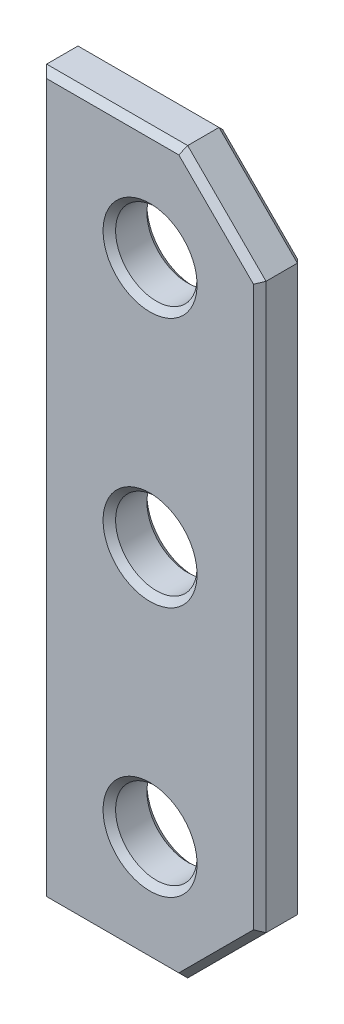
ISO-10303-21;
HEADER;
FILE_DESCRIPTION(('STEP AP214'),'2;1');
FILE_NAME('part.step','',(''),(''),'','','');
FILE_SCHEMA(('AUTOMOTIVE_DESIGN { 1 0 10303 214 1 1 1 1 }'));
ENDSEC;
DATA;
#1=APPLICATION_CONTEXT('core data for automotive mechanical design processes');
#2=APPLICATION_PROTOCOL_DEFINITION('international standard','automotive_design',2000,#1);
#3=PRODUCT_CONTEXT('',#1,'mechanical');
#4=PRODUCT('Part','Part','',(#3));
#5=PRODUCT_RELATED_PRODUCT_CATEGORY('part','',(#4));
#6=PRODUCT_DEFINITION_FORMATION('','',#4);
#7=PRODUCT_DEFINITION_CONTEXT('part definition',#1,'design');
#8=PRODUCT_DEFINITION('design','',#6,#7);
#9=PRODUCT_DEFINITION_SHAPE('','',#8);
#10=(LENGTH_UNIT() NAMED_UNIT(*) SI_UNIT(.MILLI.,.METRE.));
#11=(NAMED_UNIT(*) PLANE_ANGLE_UNIT() SI_UNIT($,.RADIAN.));
#12=(NAMED_UNIT(*) SI_UNIT($,.STERADIAN.) SOLID_ANGLE_UNIT());
#13=UNCERTAINTY_MEASURE_WITH_UNIT(LENGTH_MEASURE(1.E-05),#10,'distance_accuracy_value','');
#14=(GEOMETRIC_REPRESENTATION_CONTEXT(3) GLOBAL_UNCERTAINTY_ASSIGNED_CONTEXT((#13)) GLOBAL_UNIT_ASSIGNED_CONTEXT((#10,
#11,#12)) REPRESENTATION_CONTEXT('',''));
#15=CARTESIAN_POINT('',(0.,0.,0.));
#16=DIRECTION('',(0.,0.,1.));
#17=DIRECTION('',(1.,0.,0.));
#18=AXIS2_PLACEMENT_3D('',#15,#16,#17);
#19=CARTESIAN_POINT('',(0.,230.,14.));
#20=DIRECTION('',(0.,0.,-1.));
#21=DIRECTION('',(-1.,0.,0.));
#22=AXIS2_PLACEMENT_3D('',#19,#20,#21);
#23=PLANE('',#22);
#24=CARTESIAN_POINT('',(35.,195.,14.));
#25=DIRECTION('',(0.,0.,-1.));
#26=DIRECTION('',(-1.,0.,0.));
#27=AXIS2_PLACEMENT_3D('',#24,#25,#26);
#28=CIRCLE('',#27,15.);
#29=CARTESIAN_POINT('',(20.,195.,14.));
#30=VERTEX_POINT('',#29);
#31=EDGE_CURVE('E11',#30,#30,#28,.T.);
#32=ORIENTED_EDGE('',*,*,#31,.T.);
#33=EDGE_LOOP('',(#32));
#34=FACE_BOUND('',#33,.T.);
#35=CARTESIAN_POINT('',(35.,35.,14.));
#36=DIRECTION('',(0.,0.,-1.));
#37=DIRECTION('',(-1.,0.,0.));
#38=AXIS2_PLACEMENT_3D('',#35,#36,#37);
#39=CIRCLE('',#38,15.);
#40=CARTESIAN_POINT('',(20.,35.,14.));
#41=VERTEX_POINT('',#40);
#42=EDGE_CURVE('E44',#41,#41,#39,.T.);
#43=ORIENTED_EDGE('',*,*,#42,.T.);
#44=EDGE_LOOP('',(#43));
#45=FACE_BOUND('',#44,.T.);
#46=DIRECTION('',(-0.707106781186543,0.707106781186552,0.));
#47=VECTOR('',#46,1.);
#48=CARTESIAN_POINT('',(21.0857864376272,251.085786437627,14.));
#49=LINE('',#48,#47);
#50=CARTESIAN_POINT('',(68.,204.171572875254,14.));
#51=VERTEX_POINT('',#50);
#52=CARTESIAN_POINT('',(44.1715728752538,228.,14.));
#53=VERTEX_POINT('',#52);
#54=EDGE_CURVE('E52',#51,#53,#49,.T.);
#55=ORIENTED_EDGE('',*,*,#54,.T.);
#56=DIRECTION('',(-1.,0.,0.));
#57=VECTOR('',#56,1.);
#58=CARTESIAN_POINT('',(0.,228.,14.));
#59=LINE('',#58,#57);
#60=CARTESIAN_POINT('',(2.,228.,14.));
#61=VERTEX_POINT('',#60);
#62=EDGE_CURVE('E218',#53,#61,#59,.T.);
#63=ORIENTED_EDGE('',*,*,#62,.T.);
#64=DIRECTION('',(0.,-1.,0.));
#65=VECTOR('',#64,1.);
#66=CARTESIAN_POINT('',(2.,230.,14.));
#67=LINE('',#66,#65);
#68=CARTESIAN_POINT('',(2.,2.,14.));
#69=VERTEX_POINT('',#68);
#70=EDGE_CURVE('E210',#61,#69,#67,.T.);
#71=ORIENTED_EDGE('',*,*,#70,.T.);
#72=DIRECTION('',(1.,0.,0.));
#73=VECTOR('',#72,1.);
#74=CARTESIAN_POINT('',(0.,2.,14.));
#75=LINE('',#74,#73);
#76=CARTESIAN_POINT('',(44.1715728752538,2.,14.));
#77=VERTEX_POINT('',#76);
#78=EDGE_CURVE('E212',#69,#77,#75,.T.);
#79=ORIENTED_EDGE('',*,*,#78,.T.);
#80=DIRECTION('',(0.707106781186543,0.707106781186552,0.));
#81=VECTOR('',#80,1.);
#82=CARTESIAN_POINT('',(136.085786437627,93.9142135623746,14.));
#83=LINE('',#82,#81);
#84=CARTESIAN_POINT('',(68.,25.8284271247465,14.));
#85=VERTEX_POINT('',#84);
#86=EDGE_CURVE('E214',#77,#85,#83,.T.);
#87=ORIENTED_EDGE('',*,*,#86,.T.);
#88=DIRECTION('',(0.,1.,0.));
#89=VECTOR('',#88,1.);
#90=CARTESIAN_POINT('',(68.,230.,14.));
#91=LINE('',#90,#89);
#92=EDGE_CURVE('E57',#85,#51,#91,.T.);
#93=ORIENTED_EDGE('',*,*,#92,.T.);
#94=EDGE_LOOP('',(#55,#63,#71,#79,#87,#93));
#95=FACE_BOUND('',#94,.T.);
#96=CARTESIAN_POINT('',(35.,115.,14.));
#97=DIRECTION('',(0.,0.,-1.));
#98=DIRECTION('',(-1.,0.,0.));
#99=AXIS2_PLACEMENT_3D('',#96,#97,#98);
#100=CIRCLE('',#99,15.);
#101=CARTESIAN_POINT('',(20.,115.,14.));
#102=VERTEX_POINT('',#101);
#103=EDGE_CURVE('E207',#102,#102,#100,.T.);
#104=ORIENTED_EDGE('',*,*,#103,.T.);
#105=EDGE_LOOP('',(#104));
#106=FACE_BOUND('',#105,.T.);
#107=ADVANCED_FACE('F35',(#34,#45,#95,#106),#23,.F.);
#108=CARTESIAN_POINT('',(0.,230.,0.));
#109=DIRECTION('',(0.,0.,-1.));
#110=DIRECTION('',(-1.,0.,0.));
#111=AXIS2_PLACEMENT_3D('',#108,#109,#110);
#112=PLANE('',#111);
#113=CARTESIAN_POINT('',(35.,195.,0.));
#114=DIRECTION('',(0.,0.,-1.));
#115=DIRECTION('',(-1.,0.,0.));
#116=AXIS2_PLACEMENT_3D('',#113,#114,#115);
#117=CIRCLE('',#116,15.);
#118=CARTESIAN_POINT('',(20.,195.,0.));
#119=VERTEX_POINT('',#118);
#120=EDGE_CURVE('E157',#119,#119,#117,.F.);
#121=ORIENTED_EDGE('',*,*,#120,.T.);
#122=EDGE_LOOP('',(#121));
#123=FACE_BOUND('',#122,.T.);
#124=CARTESIAN_POINT('',(35.,35.,0.));
#125=DIRECTION('',(0.,0.,-1.));
#126=DIRECTION('',(-1.,0.,0.));
#127=AXIS2_PLACEMENT_3D('',#124,#125,#126);
#128=CIRCLE('',#127,15.);
#129=CARTESIAN_POINT('',(20.,35.,0.));
#130=VERTEX_POINT('',#129);
#131=EDGE_CURVE('E154',#130,#130,#128,.F.);
#132=ORIENTED_EDGE('',*,*,#131,.T.);
#133=EDGE_LOOP('',(#132));
#134=FACE_BOUND('',#133,.T.);
#135=DIRECTION('',(-0.707106781186543,-0.707106781186552,0.));
#136=VECTOR('',#135,1.);
#137=CARTESIAN_POINT('',(43.5857864376269,1.4142135623731,0.));
#138=LINE('',#137,#136);
#139=CARTESIAN_POINT('',(68.,25.8284271247465,0.));
#140=VERTEX_POINT('',#139);
#141=CARTESIAN_POINT('',(44.1715728752538,2.,0.));
#142=VERTEX_POINT('',#141);
#143=EDGE_CURVE('E153',#140,#142,#138,.T.);
#144=ORIENTED_EDGE('',*,*,#143,.T.);
#145=DIRECTION('',(-1.,0.,0.));
#146=VECTOR('',#145,1.);
#147=CARTESIAN_POINT('',(0.,2.,0.));
#148=LINE('',#147,#146);
#149=CARTESIAN_POINT('',(2.00000000000001,2.,0.));
#150=VERTEX_POINT('',#149);
#151=EDGE_CURVE('E131',#142,#150,#148,.T.);
#152=ORIENTED_EDGE('',*,*,#151,.T.);
#153=DIRECTION('',(0.,1.,0.));
#154=VECTOR('',#153,1.);
#155=CARTESIAN_POINT('',(2.00000000000001,230.,0.));
#156=LINE('',#155,#154);
#157=CARTESIAN_POINT('',(2.00000000000001,228.,0.));
#158=VERTEX_POINT('',#157);
#159=EDGE_CURVE('E141',#150,#158,#156,.T.);
#160=ORIENTED_EDGE('',*,*,#159,.T.);
#161=DIRECTION('',(1.,0.,0.));
#162=VECTOR('',#161,1.);
#163=CARTESIAN_POINT('',(45.,228.,0.));
#164=LINE('',#163,#162);
#165=CARTESIAN_POINT('',(44.1715728752538,228.,0.));
#166=VERTEX_POINT('',#165);
#167=EDGE_CURVE('E147',#158,#166,#164,.T.);
#168=ORIENTED_EDGE('',*,*,#167,.T.);
#169=DIRECTION('',(0.707106781186543,-0.707106781186552,0.));
#170=VECTOR('',#169,1.);
#171=CARTESIAN_POINT('',(68.5857864376269,203.585786437627,0.));
#172=LINE('',#171,#170);
#173=CARTESIAN_POINT('',(68.,204.171572875254,0.));
#174=VERTEX_POINT('',#173);
#175=EDGE_CURVE('E279',#166,#174,#172,.T.);
#176=ORIENTED_EDGE('',*,*,#175,.T.);
#177=DIRECTION('',(0.,-1.,0.));
#178=VECTOR('',#177,1.);
#179=CARTESIAN_POINT('',(68.,25.0000000000003,0.));
#180=LINE('',#179,#178);
#181=EDGE_CURVE('E159',#174,#140,#180,.T.);
#182=ORIENTED_EDGE('',*,*,#181,.T.);
#183=EDGE_LOOP('',(#144,#152,#160,#168,#176,#182));
#184=FACE_BOUND('',#183,.T.);
#185=CARTESIAN_POINT('',(35.,115.,0.));
#186=DIRECTION('',(0.,0.,-1.));
#187=DIRECTION('',(-1.,0.,0.));
#188=AXIS2_PLACEMENT_3D('',#185,#186,#187);
#189=CIRCLE('',#188,15.);
#190=CARTESIAN_POINT('',(20.,115.,0.));
#191=VERTEX_POINT('',#190);
#192=EDGE_CURVE('E148',#191,#191,#189,.F.);
#193=ORIENTED_EDGE('',*,*,#192,.T.);
#194=EDGE_LOOP('',(#193));
#195=FACE_BOUND('',#194,.T.);
#196=ADVANCED_FACE('F150',(#123,#134,#184,#195),#112,.T.);
#197=CARTESIAN_POINT('',(0.,0.,14.));
#198=DIRECTION('',(1.,0.,0.));
#199=DIRECTION('',(0.,0.,-1.));
#200=AXIS2_PLACEMENT_3D('',#197,#198,#199);
#201=PLANE('',#200);
#202=DIRECTION('',(0.,0.,-1.));
#203=VECTOR('',#202,1.);
#204=CARTESIAN_POINT('',(0.,230.,14.));
#205=LINE('',#204,#203);
#206=CARTESIAN_POINT('',(0.,230.,12.));
#207=VERTEX_POINT('',#206);
#208=CARTESIAN_POINT('',(0.,230.,2.));
#209=VERTEX_POINT('',#208);
#210=EDGE_CURVE('E232',#207,#209,#205,.T.);
#211=ORIENTED_EDGE('',*,*,#210,.T.);
#212=DIRECTION('',(0.,-1.,0.));
#213=VECTOR('',#212,1.);
#214=CARTESIAN_POINT('',(0.,0.,2.));
#215=LINE('',#214,#213);
#216=CARTESIAN_POINT('',(0.,0.,2.));
#217=VERTEX_POINT('',#216);
#218=EDGE_CURVE('E199',#209,#217,#215,.T.);
#219=ORIENTED_EDGE('',*,*,#218,.T.);
#220=DIRECTION('',(0.,0.,-1.));
#221=VECTOR('',#220,1.);
#222=CARTESIAN_POINT('',(0.,0.,14.));
#223=LINE('',#222,#221);
#224=CARTESIAN_POINT('',(0.,0.,12.));
#225=VERTEX_POINT('',#224);
#226=EDGE_CURVE('E269',#225,#217,#223,.T.);
#227=ORIENTED_EDGE('',*,*,#226,.F.);
#228=DIRECTION('',(0.,1.,0.));
#229=VECTOR('',#228,1.);
#230=CARTESIAN_POINT('',(0.,0.,12.));
#231=LINE('',#230,#229);
#232=EDGE_CURVE('E197',#225,#207,#231,.T.);
#233=ORIENTED_EDGE('',*,*,#232,.T.);
#234=EDGE_LOOP('',(#211,#219,#227,#233));
#235=FACE_BOUND('',#234,.T.);
#236=ADVANCED_FACE('F303',(#235),#201,.F.);
#237=CARTESIAN_POINT('',(0.,0.,14.));
#238=DIRECTION('',(0.,1.,0.));
#239=DIRECTION('',(0.,0.,1.));
#240=AXIS2_PLACEMENT_3D('',#237,#238,#239);
#241=PLANE('',#240);
#242=ORIENTED_EDGE('',*,*,#226,.T.);
#243=DIRECTION('',(1.,0.,0.));
#244=VECTOR('',#243,1.);
#245=CARTESIAN_POINT('',(45.,0.,2.));
#246=LINE('',#245,#244);
#247=CARTESIAN_POINT('',(45.,0.,2.));
#248=VERTEX_POINT('',#247);
#249=EDGE_CURVE('E134',#217,#248,#246,.T.);
#250=ORIENTED_EDGE('',*,*,#249,.T.);
#251=DIRECTION('',(0.,0.,-1.));
#252=VECTOR('',#251,1.);
#253=CARTESIAN_POINT('',(45.,0.,14.));
#254=LINE('',#253,#252);
#255=CARTESIAN_POINT('',(45.,0.,12.));
#256=VERTEX_POINT('',#255);
#257=EDGE_CURVE('E262',#256,#248,#254,.T.);
#258=ORIENTED_EDGE('',*,*,#257,.F.);
#259=DIRECTION('',(-1.,0.,0.));
#260=VECTOR('',#259,1.);
#261=CARTESIAN_POINT('',(0.,0.,12.));
#262=LINE('',#261,#260);
#263=EDGE_CURVE('E177',#256,#225,#262,.T.);
#264=ORIENTED_EDGE('',*,*,#263,.T.);
#265=EDGE_LOOP('',(#242,#250,#258,#264));
#266=FACE_BOUND('',#265,.T.);
#267=ADVANCED_FACE('F267',(#266),#241,.F.);
#268=CARTESIAN_POINT('',(45.,0.,14.));
#269=DIRECTION('',(-0.707106781186552,0.707106781186543,0.));
#270=DIRECTION('',(-0.707106781186543,-0.707106781186552,0.));
#271=AXIS2_PLACEMENT_3D('',#268,#269,#270);
#272=PLANE('',#271);
#273=ORIENTED_EDGE('',*,*,#257,.T.);
#274=DIRECTION('',(0.707106781186543,0.707106781186552,0.));
#275=VECTOR('',#274,1.);
#276=CARTESIAN_POINT('',(70.,25.0000000000003,2.));
#277=LINE('',#276,#275);
#278=CARTESIAN_POINT('',(70.,25.0000000000003,2.));
#279=VERTEX_POINT('',#278);
#280=EDGE_CURVE('E182',#248,#279,#277,.T.);
#281=ORIENTED_EDGE('',*,*,#280,.T.);
#282=DIRECTION('',(0.,0.,-1.));
#283=VECTOR('',#282,1.);
#284=CARTESIAN_POINT('',(70.,25.0000000000003,14.));
#285=LINE('',#284,#283);
#286=CARTESIAN_POINT('',(70.,25.0000000000003,12.));
#287=VERTEX_POINT('',#286);
#288=EDGE_CURVE('E264',#287,#279,#285,.T.);
#289=ORIENTED_EDGE('',*,*,#288,.F.);
#290=DIRECTION('',(-0.707106781186543,-0.707106781186552,0.));
#291=VECTOR('',#290,1.);
#292=CARTESIAN_POINT('',(45.,0.,12.));
#293=LINE('',#292,#291);
#294=EDGE_CURVE('E180',#287,#256,#293,.T.);
#295=ORIENTED_EDGE('',*,*,#294,.T.);
#296=EDGE_LOOP('',(#273,#281,#289,#295));
#297=FACE_BOUND('',#296,.T.);
#298=ADVANCED_FACE('F261',(#297),#272,.F.);
#299=CARTESIAN_POINT('',(70.,25.0000000000003,14.));
#300=DIRECTION('',(-1.,0.,0.));
#301=DIRECTION('',(0.,-1.,0.));
#302=AXIS2_PLACEMENT_3D('',#299,#300,#301);
#303=PLANE('',#302);
#304=ORIENTED_EDGE('',*,*,#288,.T.);
#305=DIRECTION('',(0.,1.,0.));
#306=VECTOR('',#305,1.);
#307=CARTESIAN_POINT('',(70.,205.,2.));
#308=LINE('',#307,#306);
#309=CARTESIAN_POINT('',(70.,205.,2.));
#310=VERTEX_POINT('',#309);
#311=EDGE_CURVE('E186',#279,#310,#308,.T.);
#312=ORIENTED_EDGE('',*,*,#311,.T.);
#313=DIRECTION('',(0.,0.,-1.));
#314=VECTOR('',#313,1.);
#315=CARTESIAN_POINT('',(70.,205.,14.));
#316=LINE('',#315,#314);
#317=CARTESIAN_POINT('',(70.,205.,12.));
#318=VERTEX_POINT('',#317);
#319=EDGE_CURVE('E272',#318,#310,#316,.T.);
#320=ORIENTED_EDGE('',*,*,#319,.F.);
#321=DIRECTION('',(0.,-1.,0.));
#322=VECTOR('',#321,1.);
#323=CARTESIAN_POINT('',(70.,25.0000000000003,12.));
#324=LINE('',#323,#322);
#325=EDGE_CURVE('E184',#318,#287,#324,.T.);
#326=ORIENTED_EDGE('',*,*,#325,.T.);
#327=EDGE_LOOP('',(#304,#312,#320,#326));
#328=FACE_BOUND('',#327,.T.);
#329=ADVANCED_FACE('F291',(#328),#303,.F.);
#330=CARTESIAN_POINT('',(45.,230.,14.));
#331=DIRECTION('',(-0.707106781186552,-0.707106781186543,0.));
#332=DIRECTION('',(0.707106781186543,-0.707106781186552,0.));
#333=AXIS2_PLACEMENT_3D('',#330,#331,#332);
#334=PLANE('',#333);
#335=ORIENTED_EDGE('',*,*,#319,.T.);
#336=DIRECTION('',(-0.707106781186543,0.707106781186552,0.));
#337=VECTOR('',#336,1.);
#338=CARTESIAN_POINT('',(45.,230.,2.));
#339=LINE('',#338,#337);
#340=CARTESIAN_POINT('',(45.,230.,2.));
#341=VERTEX_POINT('',#340);
#342=EDGE_CURVE('E190',#310,#341,#339,.T.);
#343=ORIENTED_EDGE('',*,*,#342,.T.);
#344=DIRECTION('',(0.,0.,-1.));
#345=VECTOR('',#344,1.);
#346=CARTESIAN_POINT('',(45.,230.,14.));
#347=LINE('',#346,#345);
#348=CARTESIAN_POINT('',(45.,230.,12.));
#349=VERTEX_POINT('',#348);
#350=EDGE_CURVE('E296',#349,#341,#347,.T.);
#351=ORIENTED_EDGE('',*,*,#350,.F.);
#352=DIRECTION('',(0.707106781186543,-0.707106781186552,0.));
#353=VECTOR('',#352,1.);
#354=CARTESIAN_POINT('',(45.,230.,12.));
#355=LINE('',#354,#353);
#356=EDGE_CURVE('E188',#349,#318,#355,.T.);
#357=ORIENTED_EDGE('',*,*,#356,.T.);
#358=EDGE_LOOP('',(#335,#343,#351,#357));
#359=FACE_BOUND('',#358,.T.);
#360=ADVANCED_FACE('F314',(#359),#334,.F.);
#361=CARTESIAN_POINT('',(0.,230.,14.));
#362=DIRECTION('',(0.,-1.,0.));
#363=DIRECTION('',(0.,0.,-1.));
#364=AXIS2_PLACEMENT_3D('',#361,#362,#363);
#365=PLANE('',#364);
#366=ORIENTED_EDGE('',*,*,#350,.T.);
#367=DIRECTION('',(-1.,0.,0.));
#368=VECTOR('',#367,1.);
#369=CARTESIAN_POINT('',(0.,230.,2.));
#370=LINE('',#369,#368);
#371=EDGE_CURVE('E195',#341,#209,#370,.T.);
#372=ORIENTED_EDGE('',*,*,#371,.T.);
#373=ORIENTED_EDGE('',*,*,#210,.F.);
#374=DIRECTION('',(1.,0.,0.));
#375=VECTOR('',#374,1.);
#376=CARTESIAN_POINT('',(0.,230.,12.));
#377=LINE('',#376,#375);
#378=EDGE_CURVE('E192',#207,#349,#377,.T.);
#379=ORIENTED_EDGE('',*,*,#378,.T.);
#380=EDGE_LOOP('',(#366,#372,#373,#379));
#381=FACE_BOUND('',#380,.T.);
#382=ADVANCED_FACE('F315',(#381),#365,.F.);
#383=CARTESIAN_POINT('',(35.,35.,14.));
#384=DIRECTION('',(0.,0.,-1.));
#385=DIRECTION('',(-1.,0.,0.));
#386=AXIS2_PLACEMENT_3D('',#383,#384,#385);
#387=CYLINDRICAL_SURFACE('',#386,13.);
#388=CARTESIAN_POINT('',(35.,35.,2.00000000000001));
#389=DIRECTION('',(0.,0.,-1.));
#390=DIRECTION('',(-1.,0.,0.));
#391=AXIS2_PLACEMENT_3D('',#388,#389,#390);
#392=CIRCLE('',#391,13.);
#393=CARTESIAN_POINT('',(22.,35.,2.00000000000001));
#394=VERTEX_POINT('',#393);
#395=EDGE_CURVE('E174',#394,#394,#392,.T.);
#396=ORIENTED_EDGE('',*,*,#395,.T.);
#397=EDGE_LOOP('',(#396));
#398=FACE_BOUND('',#397,.T.);
#399=CARTESIAN_POINT('',(35.,35.,12.));
#400=DIRECTION('',(0.,0.,-1.));
#401=DIRECTION('',(-1.,0.,0.));
#402=AXIS2_PLACEMENT_3D('',#399,#400,#401);
#403=CIRCLE('',#402,13.);
#404=CARTESIAN_POINT('',(22.,35.,12.));
#405=VERTEX_POINT('',#404);
#406=EDGE_CURVE('E171',#405,#405,#403,.F.);
#407=ORIENTED_EDGE('',*,*,#406,.T.);
#408=EDGE_LOOP('',(#407));
#409=FACE_BOUND('',#408,.T.);
#410=ADVANCED_FACE('F338',(#398,#409),#387,.F.);
#411=CARTESIAN_POINT('',(35.,115.,14.));
#412=DIRECTION('',(0.,0.,-1.));
#413=DIRECTION('',(-1.,0.,0.));
#414=AXIS2_PLACEMENT_3D('',#411,#412,#413);
#415=CYLINDRICAL_SURFACE('',#414,13.);
#416=CARTESIAN_POINT('',(35.,115.,2.00000000000001));
#417=DIRECTION('',(0.,0.,-1.));
#418=DIRECTION('',(-1.,0.,0.));
#419=AXIS2_PLACEMENT_3D('',#416,#417,#418);
#420=CIRCLE('',#419,13.);
#421=CARTESIAN_POINT('',(22.,115.,2.00000000000001));
#422=VERTEX_POINT('',#421);
#423=EDGE_CURVE('E204',#422,#422,#420,.T.);
#424=ORIENTED_EDGE('',*,*,#423,.T.);
#425=EDGE_LOOP('',(#424));
#426=FACE_BOUND('',#425,.T.);
#427=CARTESIAN_POINT('',(35.,115.,12.));
#428=DIRECTION('',(0.,0.,-1.));
#429=DIRECTION('',(-1.,0.,0.));
#430=AXIS2_PLACEMENT_3D('',#427,#428,#429);
#431=CIRCLE('',#430,13.);
#432=CARTESIAN_POINT('',(22.,115.,12.));
#433=VERTEX_POINT('',#432);
#434=EDGE_CURVE('E201',#433,#433,#431,.F.);
#435=ORIENTED_EDGE('',*,*,#434,.T.);
#436=EDGE_LOOP('',(#435));
#437=FACE_BOUND('',#436,.T.);
#438=ADVANCED_FACE('F335',(#426,#437),#415,.F.);
#439=CARTESIAN_POINT('',(35.,195.,14.));
#440=DIRECTION('',(0.,0.,-1.));
#441=DIRECTION('',(-1.,0.,0.));
#442=AXIS2_PLACEMENT_3D('',#439,#440,#441);
#443=CYLINDRICAL_SURFACE('',#442,13.);
#444=CARTESIAN_POINT('',(35.,195.,2.00000000000001));
#445=DIRECTION('',(0.,0.,-1.));
#446=DIRECTION('',(-1.,0.,0.));
#447=AXIS2_PLACEMENT_3D('',#444,#445,#446);
#448=CIRCLE('',#447,13.);
#449=CARTESIAN_POINT('',(22.,195.,2.00000000000001));
#450=VERTEX_POINT('',#449);
#451=EDGE_CURVE('E168',#450,#450,#448,.T.);
#452=ORIENTED_EDGE('',*,*,#451,.T.);
#453=EDGE_LOOP('',(#452));
#454=FACE_BOUND('',#453,.T.);
#455=CARTESIAN_POINT('',(35.,195.,12.));
#456=DIRECTION('',(0.,0.,-1.));
#457=DIRECTION('',(-1.,0.,0.));
#458=AXIS2_PLACEMENT_3D('',#455,#456,#457);
#459=CIRCLE('',#458,13.);
#460=CARTESIAN_POINT('',(22.,195.,12.));
#461=VERTEX_POINT('',#460);
#462=EDGE_CURVE('E165',#461,#461,#459,.F.);
#463=ORIENTED_EDGE('',*,*,#462,.T.);
#464=EDGE_LOOP('',(#463));
#465=FACE_BOUND('',#464,.T.);
#466=ADVANCED_FACE('F337',(#454,#465),#443,.F.);
#467=CARTESIAN_POINT('',(35.,195.,0.));
#468=DIRECTION('',(0.,0.,-1.));
#469=DIRECTION('',(-1.,0.,0.));
#470=AXIS2_PLACEMENT_3D('',#467,#468,#469);
#471=CONICAL_SURFACE('',#470,15.,0.785398163397447);
#472=ORIENTED_EDGE('',*,*,#451,.F.);
#473=EDGE_LOOP('',(#472));
#474=FACE_BOUND('',#473,.T.);
#475=ORIENTED_EDGE('',*,*,#120,.F.);
#476=EDGE_LOOP('',(#475));
#477=FACE_BOUND('',#476,.T.);
#478=ADVANCED_FACE('F345',(#474,#477),#471,.F.);
#479=CARTESIAN_POINT('',(35.,35.,0.));
#480=DIRECTION('',(0.,0.,-1.));
#481=DIRECTION('',(-1.,0.,0.));
#482=AXIS2_PLACEMENT_3D('',#479,#480,#481);
#483=CONICAL_SURFACE('',#482,15.,0.785398163397445);
#484=ORIENTED_EDGE('',*,*,#395,.F.);
#485=EDGE_LOOP('',(#484));
#486=FACE_BOUND('',#485,.T.);
#487=ORIENTED_EDGE('',*,*,#131,.F.);
#488=EDGE_LOOP('',(#487));
#489=FACE_BOUND('',#488,.T.);
#490=ADVANCED_FACE('F368',(#486,#489),#483,.F.);
#491=CARTESIAN_POINT('',(45.,230.,2.));
#492=DIRECTION('',(0.500000000000001,0.499999999999995,-0.70710678118655));
#493=DIRECTION('',(-0.816496580927726,0.,-0.577350269189625));
#494=AXIS2_PLACEMENT_3D('',#491,#492,#493);
#495=PLANE('',#494);
#496=DIRECTION('',(-0.678598344545848,-0.281084637714822,-0.678598344545846));
#497=VECTOR('',#496,1.);
#498=CARTESIAN_POINT('',(63.2561964152546,202.206625093218,-4.74380358474536));
#499=LINE('',#498,#497);
#500=EDGE_CURVE('E226',#174,#310,#499,.F.);
#501=ORIENTED_EDGE('',*,*,#500,.F.);
#502=ORIENTED_EDGE('',*,*,#175,.F.);
#503=DIRECTION('',(-0.281084637714828,-0.678598344545846,-0.678598344545845));
#504=VECTOR('',#503,1.);
#505=CARTESIAN_POINT('',(41.4446141898326,221.416539357625,-6.58346064237479));
#506=LINE('',#505,#504);
#507=EDGE_CURVE('E229',#341,#166,#506,.T.);
#508=ORIENTED_EDGE('',*,*,#507,.F.);
#509=ORIENTED_EDGE('',*,*,#342,.F.);
#510=EDGE_LOOP('',(#501,#502,#508,#509));
#511=FACE_BOUND('',#510,.T.);
#512=ADVANCED_FACE('F312',(#511),#495,.T.);
#513=CARTESIAN_POINT('',(0.,230.,2.));
#514=DIRECTION('',(0.,0.707106781186547,-0.707106781186548));
#515=DIRECTION('',(0.,0.707106781186548,0.707106781186547));
#516=AXIS2_PLACEMENT_3D('',#513,#514,#515);
#517=PLANE('',#516);
#518=ORIENTED_EDGE('',*,*,#507,.T.);
#519=ORIENTED_EDGE('',*,*,#167,.F.);
#520=DIRECTION('',(0.577350269189627,-0.577350269189625,-0.577350269189625));
#521=VECTOR('',#520,1.);
#522=CARTESIAN_POINT('',(76.6666666666668,153.333333333333,-74.6666666666665));
#523=LINE('',#522,#521);
#524=EDGE_CURVE('E144',#209,#158,#523,.T.);
#525=ORIENTED_EDGE('',*,*,#524,.F.);
#526=ORIENTED_EDGE('',*,*,#371,.F.);
#527=EDGE_LOOP('',(#518,#519,#525,#526));
#528=FACE_BOUND('',#527,.T.);
#529=ADVANCED_FACE('F309',(#528),#517,.T.);
#530=CARTESIAN_POINT('',(70.,25.0000000000003,2.));
#531=DIRECTION('',(0.707106781186547,0.,-0.707106781186549));
#532=DIRECTION('',(-0.707106781186549,0.,-0.707106781186547));
#533=AXIS2_PLACEMENT_3D('',#530,#531,#532);
#534=PLANE('',#533);
#535=ORIENTED_EDGE('',*,*,#500,.T.);
#536=ORIENTED_EDGE('',*,*,#311,.F.);
#537=DIRECTION('',(-0.678598344545847,0.281084637714823,-0.678598344545846));
#538=VECTOR('',#537,1.);
#539=CARTESIAN_POINT('',(70.,25.0000000000003,2.));
#540=LINE('',#539,#538);
#541=EDGE_CURVE('E137',#140,#279,#540,.F.);
#542=ORIENTED_EDGE('',*,*,#541,.F.);
#543=ORIENTED_EDGE('',*,*,#181,.F.);
#544=EDGE_LOOP('',(#535,#536,#542,#543));
#545=FACE_BOUND('',#544,.T.);
#546=ADVANCED_FACE('F286',(#545),#534,.T.);
#547=CARTESIAN_POINT('',(0.,0.,2.));
#548=DIRECTION('',(-0.707106781186546,0.,-0.707106781186549));
#549=DIRECTION('',(-0.707106781186549,0.,0.707106781186546));
#550=AXIS2_PLACEMENT_3D('',#547,#548,#549);
#551=PLANE('',#550);
#552=ORIENTED_EDGE('',*,*,#524,.T.);
#553=ORIENTED_EDGE('',*,*,#159,.F.);
#554=DIRECTION('',(-0.577350269189627,-0.577350269189625,0.577350269189625));
#555=VECTOR('',#554,1.);
#556=CARTESIAN_POINT('',(0.,0.,2.));
#557=LINE('',#556,#555);
#558=EDGE_CURVE('E127',#217,#150,#557,.F.);
#559=ORIENTED_EDGE('',*,*,#558,.F.);
#560=ORIENTED_EDGE('',*,*,#218,.F.);
#561=EDGE_LOOP('',(#552,#553,#559,#560));
#562=FACE_BOUND('',#561,.T.);
#563=ADVANCED_FACE('F142',(#562),#551,.T.);
#564=CARTESIAN_POINT('',(45.,0.,2.));
#565=DIRECTION('',(0.500000000000001,-0.499999999999995,-0.70710678118655));
#566=DIRECTION('',(-0.816496580927726,0.,-0.577350269189625));
#567=AXIS2_PLACEMENT_3D('',#564,#565,#566);
#568=PLANE('',#567);
#569=ORIENTED_EDGE('',*,*,#541,.T.);
#570=ORIENTED_EDGE('',*,*,#280,.F.);
#571=DIRECTION('',(-0.281084637714829,0.678598344545846,-0.678598344545845));
#572=VECTOR('',#571,1.);
#573=CARTESIAN_POINT('',(45.,0.,2.));
#574=LINE('',#573,#572);
#575=EDGE_CURVE('E138',#142,#248,#574,.F.);
#576=ORIENTED_EDGE('',*,*,#575,.F.);
#577=ORIENTED_EDGE('',*,*,#143,.F.);
#578=EDGE_LOOP('',(#569,#570,#576,#577));
#579=FACE_BOUND('',#578,.T.);
#580=ADVANCED_FACE('F289',(#579),#568,.T.);
#581=CARTESIAN_POINT('',(0.,0.,2.));
#582=DIRECTION('',(0.,-0.707106781186547,-0.707106781186548));
#583=DIRECTION('',(0.,0.707106781186548,-0.707106781186547));
#584=AXIS2_PLACEMENT_3D('',#581,#582,#583);
#585=PLANE('',#584);
#586=ORIENTED_EDGE('',*,*,#558,.T.);
#587=ORIENTED_EDGE('',*,*,#151,.F.);
#588=ORIENTED_EDGE('',*,*,#575,.T.);
#589=ORIENTED_EDGE('',*,*,#249,.F.);
#590=EDGE_LOOP('',(#586,#587,#588,#589));
#591=FACE_BOUND('',#590,.T.);
#592=ADVANCED_FACE('F129',(#591),#585,.T.);
#593=CARTESIAN_POINT('',(35.,115.,0.));
#594=DIRECTION('',(0.,0.,-1.));
#595=DIRECTION('',(-1.,0.,0.));
#596=AXIS2_PLACEMENT_3D('',#593,#594,#595);
#597=CONICAL_SURFACE('',#596,15.,0.785398163397446);
#598=ORIENTED_EDGE('',*,*,#423,.F.);
#599=EDGE_LOOP('',(#598));
#600=FACE_BOUND('',#599,.T.);
#601=ORIENTED_EDGE('',*,*,#192,.F.);
#602=EDGE_LOOP('',(#601));
#603=FACE_BOUND('',#602,.T.);
#604=ADVANCED_FACE('F375',(#600,#603),#597,.F.);
#605=CARTESIAN_POINT('',(35.,195.,12.));
#606=DIRECTION('',(0.,0.,1.));
#607=DIRECTION('',(1.,0.,0.));
#608=AXIS2_PLACEMENT_3D('',#605,#606,#607);
#609=CONICAL_SURFACE('',#608,13.,0.78539816339745);
#610=ORIENTED_EDGE('',*,*,#31,.F.);
#611=EDGE_LOOP('',(#610));
#612=FACE_BOUND('',#611,.T.);
#613=ORIENTED_EDGE('',*,*,#462,.F.);
#614=EDGE_LOOP('',(#613));
#615=FACE_BOUND('',#614,.T.);
#616=ADVANCED_FACE('F388',(#612,#615),#609,.F.);
#617=CARTESIAN_POINT('',(35.,35.,12.));
#618=DIRECTION('',(0.,0.,1.));
#619=DIRECTION('',(1.,0.,0.));
#620=AXIS2_PLACEMENT_3D('',#617,#618,#619);
#621=CONICAL_SURFACE('',#620,13.,0.785398163397451);
#622=ORIENTED_EDGE('',*,*,#42,.F.);
#623=EDGE_LOOP('',(#622));
#624=FACE_BOUND('',#623,.T.);
#625=ORIENTED_EDGE('',*,*,#406,.F.);
#626=EDGE_LOOP('',(#625));
#627=FACE_BOUND('',#626,.T.);
#628=ADVANCED_FACE('F392',(#624,#627),#621,.F.);
#629=CARTESIAN_POINT('',(136.085786437627,93.9142135623746,14.));
#630=DIRECTION('',(-0.500000000000002,0.499999999999996,-0.707106781186549));
#631=DIRECTION('',(-0.816496580927725,0.,0.577350269189627));
#632=AXIS2_PLACEMENT_3D('',#629,#630,#631);
#633=PLANE('',#632);
#634=DIRECTION('',(-0.281084637714829,0.678598344545844,0.678598344545846));
#635=VECTOR('',#634,1.);
#636=CARTESIAN_POINT('',(40.6816399105104,10.4254434952562,22.4254434952563));
#637=LINE('',#636,#635);
#638=EDGE_CURVE('E242',#256,#77,#637,.T.);
#639=ORIENTED_EDGE('',*,*,#638,.F.);
#640=ORIENTED_EDGE('',*,*,#294,.F.);
#641=DIRECTION('',(-0.678598344545846,0.281084637714822,0.678598344545847));
#642=VECTOR('',#641,1.);
#643=CARTESIAN_POINT('',(86.366286825931,18.2208620310115,-4.36628682593103));
#644=LINE('',#643,#642);
#645=EDGE_CURVE('E39',#85,#287,#644,.F.);
#646=ORIENTED_EDGE('',*,*,#645,.F.);
#647=ORIENTED_EDGE('',*,*,#86,.F.);
#648=EDGE_LOOP('',(#639,#640,#646,#647));
#649=FACE_BOUND('',#648,.T.);
#650=ADVANCED_FACE('F256',(#649),#633,.F.);
#651=CARTESIAN_POINT('',(68.,230.,14.));
#652=DIRECTION('',(-0.707106781186548,0.,-0.707106781186547));
#653=DIRECTION('',(-0.707106781186547,0.,0.707106781186548));
#654=AXIS2_PLACEMENT_3D('',#651,#652,#653);
#655=PLANE('',#654);
#656=ORIENTED_EDGE('',*,*,#645,.T.);
#657=ORIENTED_EDGE('',*,*,#325,.F.);
#658=DIRECTION('',(-0.678598344545847,-0.281084637714822,0.678598344545847));
#659=VECTOR('',#658,1.);
#660=CARTESIAN_POINT('',(72.9266063928823,206.212240059659,9.07339360711772));
#661=LINE('',#660,#659);
#662=EDGE_CURVE('E240',#51,#318,#661,.F.);
#663=ORIENTED_EDGE('',*,*,#662,.F.);
#664=ORIENTED_EDGE('',*,*,#92,.F.);
#665=EDGE_LOOP('',(#656,#657,#663,#664));
#666=FACE_BOUND('',#665,.T.);
#667=ADVANCED_FACE('F252',(#666),#655,.F.);
#668=CARTESIAN_POINT('',(0.,2.,14.));
#669=DIRECTION('',(0.,0.707106781186549,-0.707106781186547));
#670=DIRECTION('',(0.,0.707106781186547,0.707106781186549));
#671=AXIS2_PLACEMENT_3D('',#668,#669,#670);
#672=PLANE('',#671);
#673=ORIENTED_EDGE('',*,*,#638,.T.);
#674=ORIENTED_EDGE('',*,*,#78,.F.);
#675=DIRECTION('',(0.577350269189625,0.577350269189625,0.577350269189627));
#676=VECTOR('',#675,1.);
#677=CARTESIAN_POINT('',(77.9999999999998,77.9999999999999,90.0000000000001));
#678=LINE('',#677,#676);
#679=EDGE_CURVE('E237',#225,#69,#678,.T.);
#680=ORIENTED_EDGE('',*,*,#679,.F.);
#681=ORIENTED_EDGE('',*,*,#263,.F.);
#682=EDGE_LOOP('',(#673,#674,#680,#681));
#683=FACE_BOUND('',#682,.T.);
#684=ADVANCED_FACE('F404',(#683),#672,.F.);
#685=CARTESIAN_POINT('',(21.0857864376272,251.085786437627,14.));
#686=DIRECTION('',(-0.500000000000002,-0.499999999999996,-0.707106781186549));
#687=DIRECTION('',(-0.816496580927725,0.,0.577350269189627));
#688=AXIS2_PLACEMENT_3D('',#685,#686,#687);
#689=PLANE('',#688);
#690=ORIENTED_EDGE('',*,*,#662,.T.);
#691=ORIENTED_EDGE('',*,*,#356,.F.);
#692=DIRECTION('',(-0.281084637714828,-0.678598344545845,0.678598344545846));
#693=VECTOR('',#692,1.);
#694=CARTESIAN_POINT('',(46.7510631367815,234.227440373389,7.77255962661066));
#695=LINE('',#694,#693);
#696=EDGE_CURVE('E235',#53,#349,#695,.F.);
#697=ORIENTED_EDGE('',*,*,#696,.F.);
#698=ORIENTED_EDGE('',*,*,#54,.F.);
#699=EDGE_LOOP('',(#690,#691,#697,#698));
#700=FACE_BOUND('',#699,.T.);
#701=ADVANCED_FACE('F401',(#700),#689,.F.);
#702=CARTESIAN_POINT('',(2.,230.,14.));
#703=DIRECTION('',(0.707106781186549,0.,-0.707106781186546));
#704=DIRECTION('',(-0.707106781186546,0.,-0.707106781186549));
#705=AXIS2_PLACEMENT_3D('',#702,#703,#704);
#706=PLANE('',#705);
#707=ORIENTED_EDGE('',*,*,#679,.T.);
#708=ORIENTED_EDGE('',*,*,#70,.F.);
#709=DIRECTION('',(-0.577350269189625,0.577350269189625,-0.577350269189627));
#710=VECTOR('',#709,1.);
#711=CARTESIAN_POINT('',(1.33333333333333,228.666666666667,13.3333333333333));
#712=LINE('',#711,#710);
#713=EDGE_CURVE('E233',#207,#61,#712,.F.);
#714=ORIENTED_EDGE('',*,*,#713,.F.);
#715=ORIENTED_EDGE('',*,*,#232,.F.);
#716=EDGE_LOOP('',(#707,#708,#714,#715));
#717=FACE_BOUND('',#716,.T.);
#718=ADVANCED_FACE('F323',(#717),#706,.F.);
#719=CARTESIAN_POINT('',(0.,228.,14.));
#720=DIRECTION('',(0.,-0.707106781186549,-0.707106781186547));
#721=DIRECTION('',(0.,0.707106781186547,-0.707106781186549));
#722=AXIS2_PLACEMENT_3D('',#719,#720,#721);
#723=PLANE('',#722);
#724=ORIENTED_EDGE('',*,*,#696,.T.);
#725=ORIENTED_EDGE('',*,*,#378,.F.);
#726=ORIENTED_EDGE('',*,*,#713,.T.);
#727=ORIENTED_EDGE('',*,*,#62,.F.);
#728=EDGE_LOOP('',(#724,#725,#726,#727));
#729=FACE_BOUND('',#728,.T.);
#730=ADVANCED_FACE('F318',(#729),#723,.F.);
#731=CARTESIAN_POINT('',(35.,115.,12.));
#732=DIRECTION('',(0.,0.,1.));
#733=DIRECTION('',(1.,0.,0.));
#734=AXIS2_PLACEMENT_3D('',#731,#732,#733);
#735=CONICAL_SURFACE('',#734,13.,0.78539816339745);
#736=ORIENTED_EDGE('',*,*,#103,.F.);
#737=EDGE_LOOP('',(#736));
#738=FACE_BOUND('',#737,.T.);
#739=ORIENTED_EDGE('',*,*,#434,.F.);
#740=EDGE_LOOP('',(#739));
#741=FACE_BOUND('',#740,.T.);
#742=ADVANCED_FACE('F37',(#738,#741),#735,.F.);
#743=CLOSED_SHELL('',(#107,#196,#236,#267,#298,#329,#360,#382,#410,#438,#466,#478,#490,#512,
#529,#546,#563,#580,#592,#604,#616,#628,#650,#667,#684,#701,#718,#730,#742));
#744=MANIFOLD_SOLID_BREP('B2',#743);
#745=ADVANCED_BREP_SHAPE_REPRESENTATION('',(#18,#744),#14);
#746=SHAPE_DEFINITION_REPRESENTATION(#9,#745);
ENDSEC;
END-ISO-10303-21;
